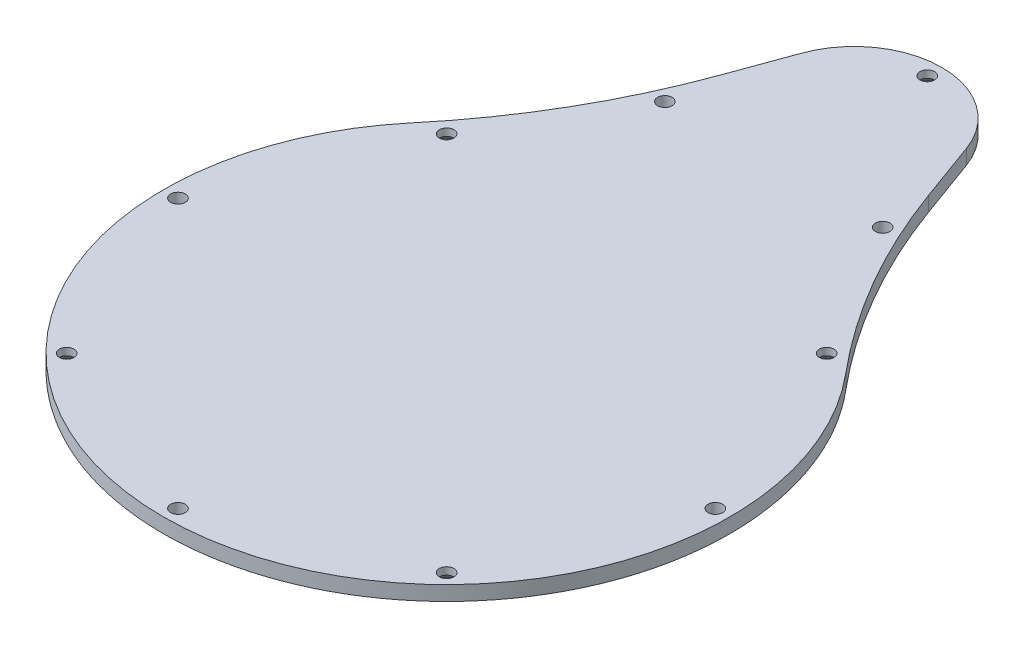
ISO-10303-21;
HEADER;
FILE_DESCRIPTION(('STEP AP214'),'2;1');
FILE_NAME('part.step','',(''),(''),'','','');
FILE_SCHEMA(('AUTOMOTIVE_DESIGN { 1 0 10303 214 1 1 1 1 }'));
ENDSEC;
DATA;
#1=APPLICATION_CONTEXT('core data for automotive mechanical design processes');
#2=APPLICATION_PROTOCOL_DEFINITION('international standard','automotive_design',2000,#1);
#3=PRODUCT_CONTEXT('',#1,'mechanical');
#4=PRODUCT('Part','Part','',(#3));
#5=PRODUCT_RELATED_PRODUCT_CATEGORY('part','',(#4));
#6=PRODUCT_DEFINITION_FORMATION('','',#4);
#7=PRODUCT_DEFINITION_CONTEXT('part definition',#1,'design');
#8=PRODUCT_DEFINITION('design','',#6,#7);
#9=PRODUCT_DEFINITION_SHAPE('','',#8);
#10=(LENGTH_UNIT() NAMED_UNIT(*) SI_UNIT(.MILLI.,.METRE.));
#11=(NAMED_UNIT(*) PLANE_ANGLE_UNIT() SI_UNIT($,.RADIAN.));
#12=(NAMED_UNIT(*) SI_UNIT($,.STERADIAN.) SOLID_ANGLE_UNIT());
#13=UNCERTAINTY_MEASURE_WITH_UNIT(LENGTH_MEASURE(1.E-05),#10,'distance_accuracy_value','');
#14=(GEOMETRIC_REPRESENTATION_CONTEXT(3) GLOBAL_UNCERTAINTY_ASSIGNED_CONTEXT((#13)) GLOBAL_UNIT_ASSIGNED_CONTEXT((#10,
#11,#12)) REPRESENTATION_CONTEXT('',''));
#15=CARTESIAN_POINT('',(0.,0.,0.));
#16=DIRECTION('',(0.,0.,1.));
#17=DIRECTION('',(1.,0.,0.));
#18=AXIS2_PLACEMENT_3D('',#15,#16,#17);
#19=CARTESIAN_POINT('',(47.3293309242248,-115.6,-142.15));
#20=DIRECTION('',(0.,1.,0.));
#21=DIRECTION('',(0.,0.,1.));
#22=AXIS2_PLACEMENT_3D('',#19,#20,#21);
#23=CYLINDRICAL_SURFACE('',#22,3.17499999999998);
#24=CARTESIAN_POINT('',(47.3293309242248,-115.6,-142.15));
#25=DIRECTION('',(0.,-1.,0.));
#26=DIRECTION('',(0.,0.,-1.));
#27=AXIS2_PLACEMENT_3D('',#24,#25,#26);
#28=CIRCLE('',#27,3.17499999999998);
#29=CARTESIAN_POINT('',(47.3293309242248,-115.6,-145.325));
#30=VERTEX_POINT('',#29);
#31=EDGE_CURVE('E228',#30,#30,#28,.F.);
#32=ORIENTED_EDGE('',*,*,#31,.F.);
#33=EDGE_LOOP('',(#32));
#34=FACE_BOUND('',#33,.T.);
#35=CARTESIAN_POINT('',(47.3293309242248,-109.25,-142.15));
#36=DIRECTION('',(0.,-1.,0.));
#37=DIRECTION('',(0.,0.,-1.));
#38=AXIS2_PLACEMENT_3D('',#35,#36,#37);
#39=CIRCLE('',#38,3.17499999999998);
#40=CARTESIAN_POINT('',(47.3293309242248,-109.25,-145.325));
#41=VERTEX_POINT('',#40);
#42=EDGE_CURVE('E211',#41,#41,#39,.F.);
#43=ORIENTED_EDGE('',*,*,#42,.T.);
#44=EDGE_LOOP('',(#43));
#45=FACE_BOUND('',#44,.T.);
#46=ADVANCED_FACE('F71',(#34,#45),#23,.F.);
#47=CARTESIAN_POINT('',(0.,-115.6,116.75));
#48=DIRECTION('',(0.,1.,0.));
#49=DIRECTION('',(0.,0.,1.));
#50=AXIS2_PLACEMENT_3D('',#47,#48,#49);
#51=CYLINDRICAL_SURFACE('',#50,3.175);
#52=CARTESIAN_POINT('',(0.,-115.6,116.75));
#53=DIRECTION('',(0.,-1.,0.));
#54=DIRECTION('',(0.,0.,-1.));
#55=AXIS2_PLACEMENT_3D('',#52,#53,#54);
#56=CIRCLE('',#55,3.175);
#57=CARTESIAN_POINT('',(0.,-115.6,113.575));
#58=VERTEX_POINT('',#57);
#59=EDGE_CURVE('E225',#58,#58,#56,.F.);
#60=ORIENTED_EDGE('',*,*,#59,.F.);
#61=EDGE_LOOP('',(#60));
#62=FACE_BOUND('',#61,.T.);
#63=CARTESIAN_POINT('',(0.,-109.25,116.75));
#64=DIRECTION('',(0.,-1.,0.));
#65=DIRECTION('',(0.,0.,-1.));
#66=AXIS2_PLACEMENT_3D('',#63,#64,#65);
#67=CIRCLE('',#66,3.175);
#68=CARTESIAN_POINT('',(0.,-109.25,113.575));
#69=VERTEX_POINT('',#68);
#70=EDGE_CURVE('E267',#69,#69,#67,.F.);
#71=ORIENTED_EDGE('',*,*,#70,.T.);
#72=EDGE_LOOP('',(#71));
#73=FACE_BOUND('',#72,.T.);
#74=ADVANCED_FACE('F316',(#62,#73),#51,.F.);
#75=CARTESIAN_POINT('',(-47.3293309242248,-115.6,-142.15));
#76=DIRECTION('',(0.,1.,0.));
#77=DIRECTION('',(0.,0.,1.));
#78=AXIS2_PLACEMENT_3D('',#75,#76,#77);
#79=CYLINDRICAL_SURFACE('',#78,3.17499999999998);
#80=CARTESIAN_POINT('',(-47.3293309242248,-115.6,-142.15));
#81=DIRECTION('',(0.,-1.,0.));
#82=DIRECTION('',(0.,0.,-1.));
#83=AXIS2_PLACEMENT_3D('',#80,#81,#82);
#84=CIRCLE('',#83,3.17499999999998);
#85=CARTESIAN_POINT('',(-47.3293309242248,-115.6,-145.325));
#86=VERTEX_POINT('',#85);
#87=EDGE_CURVE('E222',#86,#86,#84,.F.);
#88=ORIENTED_EDGE('',*,*,#87,.F.);
#89=EDGE_LOOP('',(#88));
#90=FACE_BOUND('',#89,.T.);
#91=CARTESIAN_POINT('',(-47.3293309242248,-109.25,-142.15));
#92=DIRECTION('',(0.,-1.,0.));
#93=DIRECTION('',(0.,0.,-1.));
#94=AXIS2_PLACEMENT_3D('',#91,#92,#93);
#95=CIRCLE('',#94,3.17499999999998);
#96=CARTESIAN_POINT('',(-47.3293309242248,-109.25,-145.325));
#97=VERTEX_POINT('',#96);
#98=EDGE_CURVE('E264',#97,#97,#95,.F.);
#99=ORIENTED_EDGE('',*,*,#98,.T.);
#100=EDGE_LOOP('',(#99));
#101=FACE_BOUND('',#100,.T.);
#102=ADVANCED_FACE('F322',(#90,#101),#79,.F.);
#103=CARTESIAN_POINT('',(-82.5547167035294,-115.6,-82.5547167035295));
#104=DIRECTION('',(0.,1.,0.));
#105=DIRECTION('',(0.,0.,1.));
#106=AXIS2_PLACEMENT_3D('',#103,#104,#105);
#107=CYLINDRICAL_SURFACE('',#106,3.17500000000001);
#108=CARTESIAN_POINT('',(-82.5547167035294,-112.425,-82.5547167035295));
#109=DIRECTION('',(0.,-1.,0.));
#110=DIRECTION('',(0.,0.,-1.));
#111=AXIS2_PLACEMENT_3D('',#108,#109,#110);
#112=CIRCLE('',#111,3.17500000000001);
#113=CARTESIAN_POINT('',(-82.5547167035294,-112.425,-85.7297167035294));
#114=VERTEX_POINT('',#113);
#115=EDGE_CURVE('E79',#114,#114,#112,.T.);
#116=ORIENTED_EDGE('',*,*,#115,.T.);
#117=EDGE_LOOP('',(#116));
#118=FACE_BOUND('',#117,.T.);
#119=CARTESIAN_POINT('',(-82.5547167035294,-109.25,-82.5547167035295));
#120=DIRECTION('',(0.,-1.,0.));
#121=DIRECTION('',(0.,0.,-1.));
#122=AXIS2_PLACEMENT_3D('',#119,#120,#121);
#123=CIRCLE('',#122,3.17500000000001);
#124=CARTESIAN_POINT('',(-82.5547167035294,-109.25,-85.7297167035295));
#125=VERTEX_POINT('',#124);
#126=EDGE_CURVE('E261',#125,#125,#123,.F.);
#127=ORIENTED_EDGE('',*,*,#126,.T.);
#128=EDGE_LOOP('',(#127));
#129=FACE_BOUND('',#128,.T.);
#130=ADVANCED_FACE('F188',(#118,#129),#107,.F.);
#131=CARTESIAN_POINT('',(82.5547167035294,-115.6,82.5547167035294));
#132=DIRECTION('',(0.,1.,0.));
#133=DIRECTION('',(0.,0.,1.));
#134=AXIS2_PLACEMENT_3D('',#131,#132,#133);
#135=CYLINDRICAL_SURFACE('',#134,3.17500000000001);
#136=CARTESIAN_POINT('',(82.5547167035294,-112.425,82.5547167035294));
#137=DIRECTION('',(0.,-1.,0.));
#138=DIRECTION('',(0.,0.,-1.));
#139=AXIS2_PLACEMENT_3D('',#136,#137,#138);
#140=CIRCLE('',#139,3.17500000000001);
#141=CARTESIAN_POINT('',(82.5547167035294,-112.425,79.3797167035294));
#142=VERTEX_POINT('',#141);
#143=EDGE_CURVE('E180',#142,#142,#140,.T.);
#144=ORIENTED_EDGE('',*,*,#143,.T.);
#145=EDGE_LOOP('',(#144));
#146=FACE_BOUND('',#145,.T.);
#147=CARTESIAN_POINT('',(82.5547167035294,-109.25,82.5547167035294));
#148=DIRECTION('',(0.,-1.,0.));
#149=DIRECTION('',(0.,0.,-1.));
#150=AXIS2_PLACEMENT_3D('',#147,#148,#149);
#151=CIRCLE('',#150,3.17500000000001);
#152=CARTESIAN_POINT('',(82.5547167035294,-109.25,79.3797167035294));
#153=VERTEX_POINT('',#152);
#154=EDGE_CURVE('E258',#153,#153,#151,.F.);
#155=ORIENTED_EDGE('',*,*,#154,.T.);
#156=EDGE_LOOP('',(#155));
#157=FACE_BOUND('',#156,.T.);
#158=ADVANCED_FACE('F334',(#146,#157),#135,.F.);
#159=CARTESIAN_POINT('',(0.,-115.6,-208.825));
#160=DIRECTION('',(0.,1.,0.));
#161=DIRECTION('',(0.,0.,1.));
#162=AXIS2_PLACEMENT_3D('',#159,#160,#161);
#163=CYLINDRICAL_SURFACE('',#162,3.17500000000001);
#164=CARTESIAN_POINT('',(0.,-112.425,-208.825));
#165=DIRECTION('',(0.,-1.,0.));
#166=DIRECTION('',(0.,0.,-1.));
#167=AXIS2_PLACEMENT_3D('',#164,#165,#166);
#168=CIRCLE('',#167,3.17500000000001);
#169=CARTESIAN_POINT('',(0.,-112.425,-212.));
#170=VERTEX_POINT('',#169);
#171=EDGE_CURVE('E12',#170,#170,#168,.T.);
#172=ORIENTED_EDGE('',*,*,#171,.T.);
#173=EDGE_LOOP('',(#172));
#174=FACE_BOUND('',#173,.T.);
#175=CARTESIAN_POINT('',(0.,-109.25,-208.825));
#176=DIRECTION('',(0.,-1.,0.));
#177=DIRECTION('',(0.,0.,-1.));
#178=AXIS2_PLACEMENT_3D('',#175,#176,#177);
#179=CIRCLE('',#178,3.17500000000001);
#180=CARTESIAN_POINT('',(0.,-109.25,-212.));
#181=VERTEX_POINT('',#180);
#182=EDGE_CURVE('E255',#181,#181,#179,.F.);
#183=ORIENTED_EDGE('',*,*,#182,.T.);
#184=EDGE_LOOP('',(#183));
#185=FACE_BOUND('',#184,.T.);
#186=ADVANCED_FACE('F337',(#174,#185),#163,.F.);
#187=CARTESIAN_POINT('',(82.5547167035294,-115.6,-82.5547167035294));
#188=DIRECTION('',(0.,1.,0.));
#189=DIRECTION('',(0.,0.,1.));
#190=AXIS2_PLACEMENT_3D('',#187,#188,#189);
#191=CYLINDRICAL_SURFACE('',#190,3.175);
#192=CARTESIAN_POINT('',(82.5547167035294,-112.425,-82.5547167035294));
#193=DIRECTION('',(0.,-1.,0.));
#194=DIRECTION('',(0.,0.,-1.));
#195=AXIS2_PLACEMENT_3D('',#192,#193,#194);
#196=CIRCLE('',#195,3.175);
#197=CARTESIAN_POINT('',(82.5547167035294,-112.425,-85.7297167035294));
#198=VERTEX_POINT('',#197);
#199=EDGE_CURVE('E177',#198,#198,#196,.T.);
#200=ORIENTED_EDGE('',*,*,#199,.T.);
#201=EDGE_LOOP('',(#200));
#202=FACE_BOUND('',#201,.T.);
#203=CARTESIAN_POINT('',(82.5547167035294,-109.25,-82.5547167035294));
#204=DIRECTION('',(0.,-1.,0.));
#205=DIRECTION('',(0.,0.,-1.));
#206=AXIS2_PLACEMENT_3D('',#203,#204,#205);
#207=CIRCLE('',#206,3.175);
#208=CARTESIAN_POINT('',(82.5547167035294,-109.25,-85.7297167035294));
#209=VERTEX_POINT('',#208);
#210=EDGE_CURVE('E252',#209,#209,#207,.F.);
#211=ORIENTED_EDGE('',*,*,#210,.T.);
#212=EDGE_LOOP('',(#211));
#213=FACE_BOUND('',#212,.T.);
#214=ADVANCED_FACE('F341',(#202,#213),#191,.F.);
#215=CARTESIAN_POINT('',(-82.5547167035295,-115.6,82.5547167035294));
#216=DIRECTION('',(0.,1.,0.));
#217=DIRECTION('',(0.,0.,1.));
#218=AXIS2_PLACEMENT_3D('',#215,#216,#217);
#219=CYLINDRICAL_SURFACE('',#218,3.175);
#220=CARTESIAN_POINT('',(-82.5547167035295,-112.425,82.5547167035294));
#221=DIRECTION('',(0.,-1.,0.));
#222=DIRECTION('',(0.,0.,-1.));
#223=AXIS2_PLACEMENT_3D('',#220,#221,#222);
#224=CIRCLE('',#223,3.175);
#225=CARTESIAN_POINT('',(-82.5547167035295,-112.425,79.3797167035294));
#226=VERTEX_POINT('',#225);
#227=EDGE_CURVE('E183',#226,#226,#224,.T.);
#228=ORIENTED_EDGE('',*,*,#227,.T.);
#229=EDGE_LOOP('',(#228));
#230=FACE_BOUND('',#229,.T.);
#231=CARTESIAN_POINT('',(-82.5547167035295,-109.25,82.5547167035294));
#232=DIRECTION('',(0.,-1.,0.));
#233=DIRECTION('',(0.,0.,-1.));
#234=AXIS2_PLACEMENT_3D('',#231,#232,#233);
#235=CIRCLE('',#234,3.175);
#236=CARTESIAN_POINT('',(-82.5547167035295,-109.25,79.3797167035294));
#237=VERTEX_POINT('',#236);
#238=EDGE_CURVE('E249',#237,#237,#235,.F.);
#239=ORIENTED_EDGE('',*,*,#238,.T.);
#240=EDGE_LOOP('',(#239));
#241=FACE_BOUND('',#240,.T.);
#242=ADVANCED_FACE('F345',(#230,#241),#219,.F.);
#243=CARTESIAN_POINT('',(0.,-115.6,0.));
#244=DIRECTION('',(0.,1.,0.));
#245=DIRECTION('',(0.,0.,1.));
#246=AXIS2_PLACEMENT_3D('',#243,#244,#245);
#247=CYLINDRICAL_SURFACE('',#246,123.1);
#248=CARTESIAN_POINT('',(0.,-109.25,0.));
#249=DIRECTION('',(0.,-1.,0.));
#250=DIRECTION('',(0.,0.,-1.));
#251=AXIS2_PLACEMENT_3D('',#248,#249,#250);
#252=CIRCLE('',#251,123.1);
#253=CARTESIAN_POINT('',(94.3000709479462,-109.25,-79.1271547524129));
#254=VERTEX_POINT('',#253);
#255=CARTESIAN_POINT('',(-94.3000709479463,-109.25,-79.1271547524127));
#256=VERTEX_POINT('',#255);
#257=EDGE_CURVE('E239',#254,#256,#252,.T.);
#258=ORIENTED_EDGE('',*,*,#257,.T.);
#259=DIRECTION('',(0.,1.,0.));
#260=VECTOR('',#259,1.);
#261=CARTESIAN_POINT('',(-94.3000709479463,-115.6,-79.1271547524127));
#262=LINE('',#261,#260);
#263=CARTESIAN_POINT('',(-94.3000709479463,-115.6,-79.1271547524127));
#264=VERTEX_POINT('',#263);
#265=EDGE_CURVE('E160',#264,#256,#262,.T.);
#266=ORIENTED_EDGE('',*,*,#265,.F.);
#267=CARTESIAN_POINT('',(0.,-115.6,0.));
#268=DIRECTION('',(0.,-1.,0.));
#269=DIRECTION('',(0.,0.,-1.));
#270=AXIS2_PLACEMENT_3D('',#267,#268,#269);
#271=CIRCLE('',#270,123.1);
#272=CARTESIAN_POINT('',(-87.044844764064,-115.6,87.0448447640639));
#273=VERTEX_POINT('',#272);
#274=EDGE_CURVE('E145',#273,#264,#271,.T.);
#275=ORIENTED_EDGE('',*,*,#274,.F.);
#276=CARTESIAN_POINT('',(87.0448447640639,-115.6,87.044844764064));
#277=VERTEX_POINT('',#276);
#278=EDGE_CURVE('E140',#277,#273,#271,.T.);
#279=ORIENTED_EDGE('',*,*,#278,.F.);
#280=CARTESIAN_POINT('',(94.3000709479462,-115.6,-79.1271547524129));
#281=VERTEX_POINT('',#280);
#282=EDGE_CURVE('E132',#281,#277,#271,.T.);
#283=ORIENTED_EDGE('',*,*,#282,.F.);
#284=DIRECTION('',(0.,1.,0.));
#285=VECTOR('',#284,1.);
#286=CARTESIAN_POINT('',(94.3000709479462,-115.6,-79.1271547524129));
#287=LINE('',#286,#285);
#288=EDGE_CURVE('E136',#281,#254,#287,.T.);
#289=ORIENTED_EDGE('',*,*,#288,.T.);
#290=EDGE_LOOP('',(#258,#266,#275,#279,#283,#289));
#291=FACE_BOUND('',#290,.T.);
#292=ADVANCED_FACE('F134',(#291),#247,.T.);
#293=CARTESIAN_POINT('',(-310.404168796494,-115.6,-260.460023553028));
#294=DIRECTION('',(0.,1.,0.));
#295=DIRECTION('',(0.,0.,1.));
#296=AXIS2_PLACEMENT_3D('',#293,#294,#295);
#297=CYLINDRICAL_SURFACE('',#296,282.10386458607);
#298=CARTESIAN_POINT('',(-310.404168796494,-109.25,-260.460023553028));
#299=DIRECTION('',(0.,-1.,0.));
#300=DIRECTION('',(0.,0.,-1.));
#301=AXIS2_PLACEMENT_3D('',#298,#299,#300);
#302=CIRCLE('',#301,282.10386458607);
#303=CARTESIAN_POINT('',(-45.3132489497764,-109.25,-163.974819354577));
#304=VERTEX_POINT('',#303);
#305=EDGE_CURVE('E241',#256,#304,#302,.F.);
#306=ORIENTED_EDGE('',*,*,#305,.T.);
#307=DIRECTION('',(0.,1.,0.));
#308=VECTOR('',#307,1.);
#309=CARTESIAN_POINT('',(-45.3132489497764,-115.6,-163.974819354577));
#310=LINE('',#309,#308);
#311=CARTESIAN_POINT('',(-45.3132489497764,-115.6,-163.974819354577));
#312=VERTEX_POINT('',#311);
#313=EDGE_CURVE('E165',#312,#304,#310,.T.);
#314=ORIENTED_EDGE('',*,*,#313,.F.);
#315=CARTESIAN_POINT('',(-310.404168796494,-115.6,-260.460023553028));
#316=DIRECTION('',(0.,-1.,0.));
#317=DIRECTION('',(0.,0.,-1.));
#318=AXIS2_PLACEMENT_3D('',#315,#316,#317);
#319=CIRCLE('',#318,282.10386458607);
#320=EDGE_CURVE('E143',#264,#312,#319,.F.);
#321=ORIENTED_EDGE('',*,*,#320,.F.);
#322=ORIENTED_EDGE('',*,*,#265,.T.);
#323=EDGE_LOOP('',(#306,#314,#321,#322));
#324=FACE_BOUND('',#323,.T.);
#325=ADVANCED_FACE('F300',(#324),#297,.F.);
#326=CARTESIAN_POINT('',(-92.713096844564,-115.6,-33.7448075780601));
#327=DIRECTION('',(0.939692620785911,0.,0.34202014332566));
#328=DIRECTION('',(0.34202014332566,0.,-0.939692620785912));
#329=AXIS2_PLACEMENT_3D('',#326,#327,#328);
#330=PLANE('',#329);
#331=DIRECTION('',(0.34202014332566,0.,-0.939692620785912));
#332=VECTOR('',#331,1.);
#333=CARTESIAN_POINT('',(-92.713096844564,-109.25,-33.7448075780601));
#334=LINE('',#333,#332);
#335=CARTESIAN_POINT('',(-35.8022888519432,-109.25,-190.105967460708));
#336=VERTEX_POINT('',#335);
#337=EDGE_CURVE('E243',#304,#336,#334,.T.);
#338=ORIENTED_EDGE('',*,*,#337,.T.);
#339=DIRECTION('',(0.,1.,0.));
#340=VECTOR('',#339,1.);
#341=CARTESIAN_POINT('',(-35.8022888519432,-115.6,-190.105967460708));
#342=LINE('',#341,#340);
#343=CARTESIAN_POINT('',(-35.8022888519432,-115.6,-190.105967460708));
#344=VERTEX_POINT('',#343);
#345=EDGE_CURVE('E276',#344,#336,#342,.T.);
#346=ORIENTED_EDGE('',*,*,#345,.F.);
#347=DIRECTION('',(0.34202014332566,0.,-0.939692620785912));
#348=VECTOR('',#347,1.);
#349=CARTESIAN_POINT('',(-92.713096844564,-115.6,-33.7448075780601));
#350=LINE('',#349,#348);
#351=EDGE_CURVE('E215',#312,#344,#350,.T.);
#352=ORIENTED_EDGE('',*,*,#351,.F.);
#353=ORIENTED_EDGE('',*,*,#313,.T.);
#354=EDGE_LOOP('',(#338,#346,#352,#353));
#355=FACE_BOUND('',#354,.T.);
#356=ADVANCED_FACE('F283',(#355),#330,.F.);
#357=CARTESIAN_POINT('',(0.,-115.6,-177.075));
#358=DIRECTION('',(0.,1.,0.));
#359=DIRECTION('',(0.,0.,1.));
#360=AXIS2_PLACEMENT_3D('',#357,#358,#359);
#361=CYLINDRICAL_SURFACE('',#360,38.1);
#362=CARTESIAN_POINT('',(0.,-109.25,-177.075));
#363=DIRECTION('',(0.,-1.,0.));
#364=DIRECTION('',(0.,0.,-1.));
#365=AXIS2_PLACEMENT_3D('',#362,#363,#364);
#366=CIRCLE('',#365,38.1);
#367=CARTESIAN_POINT('',(35.8022888519432,-109.25,-190.105967460708));
#368=VERTEX_POINT('',#367);
#369=EDGE_CURVE('E245',#336,#368,#366,.T.);
#370=ORIENTED_EDGE('',*,*,#369,.T.);
#371=DIRECTION('',(0.,1.,0.));
#372=VECTOR('',#371,1.);
#373=CARTESIAN_POINT('',(35.8022888519432,-115.6,-190.105967460708));
#374=LINE('',#373,#372);
#375=CARTESIAN_POINT('',(35.8022888519432,-115.6,-190.105967460708));
#376=VERTEX_POINT('',#375);
#377=EDGE_CURVE('E273',#376,#368,#374,.T.);
#378=ORIENTED_EDGE('',*,*,#377,.F.);
#379=CARTESIAN_POINT('',(0.,-115.6,-177.075));
#380=DIRECTION('',(0.,-1.,0.));
#381=DIRECTION('',(0.,0.,-1.));
#382=AXIS2_PLACEMENT_3D('',#379,#380,#381);
#383=CIRCLE('',#382,38.1);
#384=CARTESIAN_POINT('',(0.,-115.6,-215.175));
#385=VERTEX_POINT('',#384);
#386=EDGE_CURVE('E217',#385,#376,#383,.T.);
#387=ORIENTED_EDGE('',*,*,#386,.F.);
#388=EDGE_CURVE('E218',#344,#385,#383,.T.);
#389=ORIENTED_EDGE('',*,*,#388,.F.);
#390=ORIENTED_EDGE('',*,*,#345,.T.);
#391=EDGE_LOOP('',(#370,#378,#387,#389,#390));
#392=FACE_BOUND('',#391,.T.);
#393=ADVANCED_FACE('F294',(#392),#361,.T.);
#394=CARTESIAN_POINT('',(92.7130968445642,-115.6,-33.7448075780604));
#395=DIRECTION('',(-0.939692620785911,0.,0.342020143325662));
#396=DIRECTION('',(0.342020143325662,0.,0.939692620785911));
#397=AXIS2_PLACEMENT_3D('',#394,#395,#396);
#398=PLANE('',#397);
#399=DIRECTION('',(0.342020143325662,0.,0.939692620785911));
#400=VECTOR('',#399,1.);
#401=CARTESIAN_POINT('',(92.7130968445642,-109.25,-33.7448075780604));
#402=LINE('',#401,#400);
#403=CARTESIAN_POINT('',(45.3132489497764,-109.25,-163.974819354577));
#404=VERTEX_POINT('',#403);
#405=EDGE_CURVE('E247',#368,#404,#402,.T.);
#406=ORIENTED_EDGE('',*,*,#405,.T.);
#407=DIRECTION('',(0.,1.,0.));
#408=VECTOR('',#407,1.);
#409=CARTESIAN_POINT('',(45.3132489497764,-115.6,-163.974819354577));
#410=LINE('',#409,#408);
#411=CARTESIAN_POINT('',(45.3132489497764,-115.6,-163.974819354577));
#412=VERTEX_POINT('',#411);
#413=EDGE_CURVE('E231',#412,#404,#410,.T.);
#414=ORIENTED_EDGE('',*,*,#413,.F.);
#415=DIRECTION('',(0.342020143325662,0.,0.939692620785911));
#416=VECTOR('',#415,1.);
#417=CARTESIAN_POINT('',(92.7130968445642,-115.6,-33.7448075780604));
#418=LINE('',#417,#416);
#419=EDGE_CURVE('E151',#376,#412,#418,.T.);
#420=ORIENTED_EDGE('',*,*,#419,.F.);
#421=ORIENTED_EDGE('',*,*,#377,.T.);
#422=EDGE_LOOP('',(#406,#414,#420,#421));
#423=FACE_BOUND('',#422,.T.);
#424=ADVANCED_FACE('F298',(#423),#398,.F.);
#425=CARTESIAN_POINT('',(310.404168796494,-115.6,-260.460023553028));
#426=DIRECTION('',(0.,1.,0.));
#427=DIRECTION('',(0.,0.,1.));
#428=AXIS2_PLACEMENT_3D('',#425,#426,#427);
#429=CYLINDRICAL_SURFACE('',#428,282.10386458607);
#430=CARTESIAN_POINT('',(310.404168796494,-109.25,-260.460023553028));
#431=DIRECTION('',(0.,-1.,0.));
#432=DIRECTION('',(0.,0.,-1.));
#433=AXIS2_PLACEMENT_3D('',#430,#431,#432);
#434=CIRCLE('',#433,282.10386458607);
#435=EDGE_CURVE('E159',#404,#254,#434,.F.);
#436=ORIENTED_EDGE('',*,*,#435,.T.);
#437=ORIENTED_EDGE('',*,*,#288,.F.);
#438=CARTESIAN_POINT('',(310.404168796494,-115.6,-260.460023553028));
#439=DIRECTION('',(0.,-1.,0.));
#440=DIRECTION('',(0.,0.,-1.));
#441=AXIS2_PLACEMENT_3D('',#438,#439,#440);
#442=CIRCLE('',#441,282.10386458607);
#443=EDGE_CURVE('E147',#412,#281,#442,.F.);
#444=ORIENTED_EDGE('',*,*,#443,.F.);
#445=ORIENTED_EDGE('',*,*,#413,.T.);
#446=EDGE_LOOP('',(#436,#437,#444,#445));
#447=FACE_BOUND('',#446,.T.);
#448=ADVANCED_FACE('F157',(#447),#429,.F.);
#449=CARTESIAN_POINT('',(-116.75,-115.6,0.));
#450=DIRECTION('',(0.,1.,0.));
#451=DIRECTION('',(0.,0.,1.));
#452=AXIS2_PLACEMENT_3D('',#449,#450,#451);
#453=CYLINDRICAL_SURFACE('',#452,3.175);
#454=CARTESIAN_POINT('',(-116.75,-115.6,0.));
#455=DIRECTION('',(0.,-1.,0.));
#456=DIRECTION('',(0.,0.,-1.));
#457=AXIS2_PLACEMENT_3D('',#454,#455,#456);
#458=CIRCLE('',#457,3.175);
#459=CARTESIAN_POINT('',(-116.75,-115.6,-3.17500000000003));
#460=VERTEX_POINT('',#459);
#461=EDGE_CURVE('E155',#460,#460,#458,.F.);
#462=ORIENTED_EDGE('',*,*,#461,.F.);
#463=EDGE_LOOP('',(#462));
#464=FACE_BOUND('',#463,.T.);
#465=CARTESIAN_POINT('',(-116.75,-109.25,0.));
#466=DIRECTION('',(0.,-1.,0.));
#467=DIRECTION('',(0.,0.,-1.));
#468=AXIS2_PLACEMENT_3D('',#465,#466,#467);
#469=CIRCLE('',#468,3.175);
#470=CARTESIAN_POINT('',(-116.75,-109.25,-3.17500000000003));
#471=VERTEX_POINT('',#470);
#472=EDGE_CURVE('E235',#471,#471,#469,.F.);
#473=ORIENTED_EDGE('',*,*,#472,.T.);
#474=EDGE_LOOP('',(#473));
#475=FACE_BOUND('',#474,.T.);
#476=ADVANCED_FACE('F362',(#464,#475),#453,.F.);
#477=CARTESIAN_POINT('',(116.75,-115.6,0.));
#478=DIRECTION('',(0.,1.,0.));
#479=DIRECTION('',(0.,0.,1.));
#480=AXIS2_PLACEMENT_3D('',#477,#478,#479);
#481=CYLINDRICAL_SURFACE('',#480,3.175);
#482=CARTESIAN_POINT('',(116.75,-115.6,0.));
#483=DIRECTION('',(0.,-1.,0.));
#484=DIRECTION('',(0.,0.,-1.));
#485=AXIS2_PLACEMENT_3D('',#482,#483,#484);
#486=CIRCLE('',#485,3.175);
#487=CARTESIAN_POINT('',(116.75,-115.6,-3.17499999999998));
#488=VERTEX_POINT('',#487);
#489=EDGE_CURVE('E206',#488,#488,#486,.F.);
#490=ORIENTED_EDGE('',*,*,#489,.F.);
#491=EDGE_LOOP('',(#490));
#492=FACE_BOUND('',#491,.T.);
#493=CARTESIAN_POINT('',(116.75,-109.25,0.));
#494=DIRECTION('',(0.,-1.,0.));
#495=DIRECTION('',(0.,0.,-1.));
#496=AXIS2_PLACEMENT_3D('',#493,#494,#495);
#497=CIRCLE('',#496,3.175);
#498=CARTESIAN_POINT('',(116.75,-109.25,-3.17499999999998));
#499=VERTEX_POINT('',#498);
#500=EDGE_CURVE('E232',#499,#499,#497,.F.);
#501=ORIENTED_EDGE('',*,*,#500,.T.);
#502=EDGE_LOOP('',(#501));
#503=FACE_BOUND('',#502,.T.);
#504=ADVANCED_FACE('F365',(#492,#503),#481,.F.);
#505=CARTESIAN_POINT('',(0.,-109.25,0.));
#506=DIRECTION('',(0.,-1.,0.));
#507=DIRECTION('',(0.,0.,-1.));
#508=AXIS2_PLACEMENT_3D('',#505,#506,#507);
#509=PLANE('',#508);
#510=ORIENTED_EDGE('',*,*,#500,.F.);
#511=EDGE_LOOP('',(#510));
#512=FACE_BOUND('',#511,.T.);
#513=ORIENTED_EDGE('',*,*,#472,.F.);
#514=EDGE_LOOP('',(#513));
#515=FACE_BOUND('',#514,.T.);
#516=ORIENTED_EDGE('',*,*,#435,.F.);
#517=ORIENTED_EDGE('',*,*,#405,.F.);
#518=ORIENTED_EDGE('',*,*,#369,.F.);
#519=ORIENTED_EDGE('',*,*,#337,.F.);
#520=ORIENTED_EDGE('',*,*,#305,.F.);
#521=ORIENTED_EDGE('',*,*,#257,.F.);
#522=EDGE_LOOP('',(#516,#517,#518,#519,#520,#521));
#523=FACE_BOUND('',#522,.T.);
#524=ORIENTED_EDGE('',*,*,#238,.F.);
#525=EDGE_LOOP('',(#524));
#526=FACE_BOUND('',#525,.T.);
#527=ORIENTED_EDGE('',*,*,#210,.F.);
#528=EDGE_LOOP('',(#527));
#529=FACE_BOUND('',#528,.T.);
#530=ORIENTED_EDGE('',*,*,#182,.F.);
#531=EDGE_LOOP('',(#530));
#532=FACE_BOUND('',#531,.T.);
#533=ORIENTED_EDGE('',*,*,#154,.F.);
#534=EDGE_LOOP('',(#533));
#535=FACE_BOUND('',#534,.T.);
#536=ORIENTED_EDGE('',*,*,#126,.F.);
#537=EDGE_LOOP('',(#536));
#538=FACE_BOUND('',#537,.T.);
#539=ORIENTED_EDGE('',*,*,#98,.F.);
#540=EDGE_LOOP('',(#539));
#541=FACE_BOUND('',#540,.T.);
#542=ORIENTED_EDGE('',*,*,#70,.F.);
#543=EDGE_LOOP('',(#542));
#544=FACE_BOUND('',#543,.T.);
#545=ORIENTED_EDGE('',*,*,#42,.F.);
#546=EDGE_LOOP('',(#545));
#547=FACE_BOUND('',#546,.T.);
#548=ADVANCED_FACE('F200',(#512,#515,#523,#526,#529,#532,#535,#538,#541,#544,#547),#509,.F.);
#549=CARTESIAN_POINT('',(0.,-115.6,0.));
#550=DIRECTION('',(0.,-1.,0.));
#551=DIRECTION('',(0.,0.,-1.));
#552=AXIS2_PLACEMENT_3D('',#549,#550,#551);
#553=PLANE('',#552);
#554=CARTESIAN_POINT('',(82.5547167035294,-115.6,-82.5547167035294));
#555=DIRECTION('',(0.,-1.,0.));
#556=DIRECTION('',(0.,0.,-1.));
#557=AXIS2_PLACEMENT_3D('',#554,#555,#556);
#558=CIRCLE('',#557,6.35000000000002);
#559=CARTESIAN_POINT('',(82.5547167035294,-115.6,-88.9047167035294));
#560=VERTEX_POINT('',#559);
#561=EDGE_CURVE('E174',#560,#560,#558,.F.);
#562=ORIENTED_EDGE('',*,*,#561,.T.);
#563=EDGE_LOOP('',(#562));
#564=FACE_BOUND('',#563,.T.);
#565=CARTESIAN_POINT('',(-82.5547167035294,-115.6,-82.5547167035295));
#566=DIRECTION('',(0.,-1.,0.));
#567=DIRECTION('',(0.,0.,-1.));
#568=AXIS2_PLACEMENT_3D('',#565,#566,#567);
#569=CIRCLE('',#568,6.35000000000002);
#570=CARTESIAN_POINT('',(-82.5547167035294,-115.6,-88.9047167035295));
#571=VERTEX_POINT('',#570);
#572=EDGE_CURVE('E162',#571,#571,#569,.F.);
#573=ORIENTED_EDGE('',*,*,#572,.T.);
#574=EDGE_LOOP('',(#573));
#575=FACE_BOUND('',#574,.T.);
#576=ORIENTED_EDGE('',*,*,#489,.T.);
#577=EDGE_LOOP('',(#576));
#578=FACE_BOUND('',#577,.T.);
#579=ORIENTED_EDGE('',*,*,#461,.T.);
#580=EDGE_LOOP('',(#579));
#581=FACE_BOUND('',#580,.T.);
#582=ORIENTED_EDGE('',*,*,#282,.T.);
#583=CARTESIAN_POINT('',(82.5547167035294,-115.6,82.5547167035294));
#584=DIRECTION('',(0.,-1.,0.));
#585=DIRECTION('',(0.,0.,-1.));
#586=AXIS2_PLACEMENT_3D('',#583,#584,#585);
#587=CIRCLE('',#586,6.35000000000002);
#588=EDGE_CURVE('E172',#277,#277,#587,.F.);
#589=ORIENTED_EDGE('',*,*,#588,.T.);
#590=ORIENTED_EDGE('',*,*,#278,.T.);
#591=CARTESIAN_POINT('',(-82.5547167035295,-115.6,82.5547167035294));
#592=DIRECTION('',(0.,-1.,0.));
#593=DIRECTION('',(0.,0.,-1.));
#594=AXIS2_PLACEMENT_3D('',#591,#592,#593);
#595=CIRCLE('',#594,6.35000000000002);
#596=EDGE_CURVE('E89',#273,#273,#595,.F.);
#597=ORIENTED_EDGE('',*,*,#596,.T.);
#598=ORIENTED_EDGE('',*,*,#274,.T.);
#599=ORIENTED_EDGE('',*,*,#320,.T.);
#600=ORIENTED_EDGE('',*,*,#351,.T.);
#601=ORIENTED_EDGE('',*,*,#388,.T.);
#602=CARTESIAN_POINT('',(0.,-115.6,-208.825));
#603=DIRECTION('',(0.,-1.,0.));
#604=DIRECTION('',(0.,0.,-1.));
#605=AXIS2_PLACEMENT_3D('',#602,#603,#604);
#606=CIRCLE('',#605,6.34999999999997);
#607=EDGE_CURVE('E84',#385,#385,#606,.F.);
#608=ORIENTED_EDGE('',*,*,#607,.T.);
#609=ORIENTED_EDGE('',*,*,#386,.T.);
#610=ORIENTED_EDGE('',*,*,#419,.T.);
#611=ORIENTED_EDGE('',*,*,#443,.T.);
#612=EDGE_LOOP('',(#582,#589,#590,#597,#598,#599,#600,#601,#608,#609,#610,#611));
#613=FACE_BOUND('',#612,.T.);
#614=ORIENTED_EDGE('',*,*,#87,.T.);
#615=EDGE_LOOP('',(#614));
#616=FACE_BOUND('',#615,.T.);
#617=ORIENTED_EDGE('',*,*,#59,.T.);
#618=EDGE_LOOP('',(#617));
#619=FACE_BOUND('',#618,.T.);
#620=ORIENTED_EDGE('',*,*,#31,.T.);
#621=EDGE_LOOP('',(#620));
#622=FACE_BOUND('',#621,.T.);
#623=ADVANCED_FACE('F148',(#564,#575,#578,#581,#613,#616,#619,#622),#553,.T.);
#624=CARTESIAN_POINT('',(82.5547167035294,-115.6,-82.5547167035294));
#625=DIRECTION('',(0.,-1.,0.));
#626=DIRECTION('',(0.,0.,-1.));
#627=AXIS2_PLACEMENT_3D('',#624,#625,#626);
#628=CONICAL_SURFACE('',#627,6.35000000000002,0.785398163397448);
#629=ORIENTED_EDGE('',*,*,#199,.F.);
#630=EDGE_LOOP('',(#629));
#631=FACE_BOUND('',#630,.T.);
#632=ORIENTED_EDGE('',*,*,#561,.F.);
#633=EDGE_LOOP('',(#632));
#634=FACE_BOUND('',#633,.T.);
#635=ADVANCED_FACE('F199',(#631,#634),#628,.F.);
#636=CARTESIAN_POINT('',(82.5547167035294,-115.6,82.5547167035294));
#637=DIRECTION('',(0.,-1.,0.));
#638=DIRECTION('',(0.,0.,-1.));
#639=AXIS2_PLACEMENT_3D('',#636,#637,#638);
#640=CONICAL_SURFACE('',#639,6.35000000000002,0.785398163397449);
#641=ORIENTED_EDGE('',*,*,#143,.F.);
#642=EDGE_LOOP('',(#641));
#643=FACE_BOUND('',#642,.T.);
#644=ORIENTED_EDGE('',*,*,#588,.F.);
#645=EDGE_LOOP('',(#644));
#646=FACE_BOUND('',#645,.T.);
#647=ADVANCED_FACE('F302',(#643,#646),#640,.F.);
#648=CARTESIAN_POINT('',(-82.5547167035295,-115.6,82.5547167035294));
#649=DIRECTION('',(0.,-1.,0.));
#650=DIRECTION('',(0.,0.,-1.));
#651=AXIS2_PLACEMENT_3D('',#648,#649,#650);
#652=CONICAL_SURFACE('',#651,6.35000000000002,0.785398163397448);
#653=ORIENTED_EDGE('',*,*,#227,.F.);
#654=EDGE_LOOP('',(#653));
#655=FACE_BOUND('',#654,.T.);
#656=ORIENTED_EDGE('',*,*,#596,.F.);
#657=EDGE_LOOP('',(#656));
#658=FACE_BOUND('',#657,.T.);
#659=ADVANCED_FACE('F194',(#655,#658),#652,.F.);
#660=CARTESIAN_POINT('',(-82.5547167035294,-115.6,-82.5547167035295));
#661=DIRECTION('',(0.,-1.,0.));
#662=DIRECTION('',(0.,0.,-1.));
#663=AXIS2_PLACEMENT_3D('',#660,#661,#662);
#664=CONICAL_SURFACE('',#663,6.35000000000002,0.785398163397449);
#665=CARTESIAN_POINT('',(-82.5547167035294,-112.425,-85.7297167035294));
#666=CARTESIAN_POINT('',(-82.5547167035294,-112.458072916667,-85.7627896201961));
#667=CARTESIAN_POINT('',(-82.5547167035294,-112.491145833333,-85.7958625368628));
#668=CARTESIAN_POINT('',(-82.5547167035294,-112.557291666667,-85.8620083701961));
#669=CARTESIAN_POINT('',(-82.5547167035294,-112.590364583333,-85.8950812868628));
#670=CARTESIAN_POINT('',(-82.5547167035294,-112.656510416667,-85.9612271201961));
#671=CARTESIAN_POINT('',(-82.5547167035294,-112.689583333333,-85.9943000368628));
#672=CARTESIAN_POINT('',(-82.5547167035294,-112.755729166667,-86.0604458701961));
#673=CARTESIAN_POINT('',(-82.5547167035294,-112.788802083333,-86.0935187868628));
#674=CARTESIAN_POINT('',(-82.5547167035294,-112.854947916667,-86.1596646201961));
#675=CARTESIAN_POINT('',(-82.5547167035294,-112.888020833333,-86.1927375368628));
#676=CARTESIAN_POINT('',(-82.5547167035294,-112.954166666667,-86.2588833701961));
#677=CARTESIAN_POINT('',(-82.5547167035294,-112.987239583333,-86.2919562868628));
#678=CARTESIAN_POINT('',(-82.5547167035294,-113.053385416667,-86.3581021201961));
#679=CARTESIAN_POINT('',(-82.5547167035294,-113.086458333333,-86.3911750368628));
#680=CARTESIAN_POINT('',(-82.5547167035294,-113.152604166667,-86.4573208701961));
#681=CARTESIAN_POINT('',(-82.5547167035294,-113.185677083333,-86.4903937868628));
#682=CARTESIAN_POINT('',(-82.5547167035294,-113.251822916667,-86.5565396201961));
#683=CARTESIAN_POINT('',(-82.5547167035294,-113.284895833333,-86.5896125368628));
#684=CARTESIAN_POINT('',(-82.5547167035294,-113.351041666667,-86.6557583701961));
#685=CARTESIAN_POINT('',(-82.5547167035294,-113.384114583333,-86.6888312868628));
#686=CARTESIAN_POINT('',(-82.5547167035294,-113.450260416667,-86.7549771201961));
#687=CARTESIAN_POINT('',(-82.5547167035294,-113.483333333333,-86.7880500368628));
#688=CARTESIAN_POINT('',(-82.5547167035294,-113.549479166667,-86.8541958701961));
#689=CARTESIAN_POINT('',(-82.5547167035294,-113.582552083333,-86.8872687868628));
#690=CARTESIAN_POINT('',(-82.5547167035294,-113.648697916667,-86.9534146201961));
#691=CARTESIAN_POINT('',(-82.5547167035294,-113.681770833333,-86.9864875368628));
#692=CARTESIAN_POINT('',(-82.5547167035294,-113.747916666667,-87.0526333701961));
#693=CARTESIAN_POINT('',(-82.5547167035294,-113.780989583333,-87.0857062868628));
#694=CARTESIAN_POINT('',(-82.5547167035294,-113.847135416667,-87.1518521201961));
#695=CARTESIAN_POINT('',(-82.5547167035294,-113.880208333333,-87.1849250368628));
#696=CARTESIAN_POINT('',(-82.5547167035294,-113.946354166667,-87.2510708701961));
#697=CARTESIAN_POINT('',(-82.5547167035294,-113.979427083333,-87.2841437868628));
#698=CARTESIAN_POINT('',(-82.5547167035294,-114.045572916667,-87.3502896201961));
#699=CARTESIAN_POINT('',(-82.5547167035294,-114.078645833333,-87.3833625368628));
#700=CARTESIAN_POINT('',(-82.5547167035294,-114.144791666667,-87.4495083701961));
#701=CARTESIAN_POINT('',(-82.5547167035294,-114.177864583333,-87.4825812868628));
#702=CARTESIAN_POINT('',(-82.5547167035294,-114.244010416667,-87.5487271201961));
#703=CARTESIAN_POINT('',(-82.5547167035294,-114.277083333333,-87.5818000368628));
#704=CARTESIAN_POINT('',(-82.5547167035294,-114.343229166667,-87.6479458701961));
#705=CARTESIAN_POINT('',(-82.5547167035294,-114.376302083333,-87.6810187868628));
#706=CARTESIAN_POINT('',(-82.5547167035294,-114.442447916667,-87.7471646201961));
#707=CARTESIAN_POINT('',(-82.5547167035294,-114.475520833333,-87.7802375368628));
#708=CARTESIAN_POINT('',(-82.5547167035294,-114.541666666667,-87.8463833701961));
#709=CARTESIAN_POINT('',(-82.5547167035294,-114.574739583333,-87.8794562868628));
#710=CARTESIAN_POINT('',(-82.5547167035294,-114.640885416667,-87.9456021201961));
#711=CARTESIAN_POINT('',(-82.5547167035294,-114.673958333333,-87.9786750368628));
#712=CARTESIAN_POINT('',(-82.5547167035294,-114.740104166667,-88.0448208701961));
#713=CARTESIAN_POINT('',(-82.5547167035294,-114.773177083333,-88.0778937868628));
#714=CARTESIAN_POINT('',(-82.5547167035294,-114.839322916667,-88.1440396201961));
#715=CARTESIAN_POINT('',(-82.5547167035294,-114.872395833333,-88.1771125368628));
#716=CARTESIAN_POINT('',(-82.5547167035294,-114.938541666667,-88.2432583701961));
#717=CARTESIAN_POINT('',(-82.5547167035294,-114.971614583333,-88.2763312868628));
#718=CARTESIAN_POINT('',(-82.5547167035294,-115.037760416667,-88.3424771201961));
#719=CARTESIAN_POINT('',(-82.5547167035294,-115.070833333333,-88.3755500368628));
#720=CARTESIAN_POINT('',(-82.5547167035294,-115.136979166667,-88.4416958701961));
#721=CARTESIAN_POINT('',(-82.5547167035294,-115.170052083333,-88.4747687868628));
#722=CARTESIAN_POINT('',(-82.5547167035294,-115.236197916667,-88.5409146201961));
#723=CARTESIAN_POINT('',(-82.5547167035294,-115.269270833333,-88.5739875368628));
#724=CARTESIAN_POINT('',(-82.5547167035294,-115.335416666667,-88.6401333701961));
#725=CARTESIAN_POINT('',(-82.5547167035294,-115.368489583333,-88.6732062868628));
#726=CARTESIAN_POINT('',(-82.5547167035294,-115.434635416667,-88.7393521201961));
#727=CARTESIAN_POINT('',(-82.5547167035294,-115.467708333333,-88.7724250368628));
#728=CARTESIAN_POINT('',(-82.5547167035294,-115.533854166667,-88.8385708701961));
#729=CARTESIAN_POINT('',(-82.5547167035294,-115.566927083333,-88.8716437868628));
#730=CARTESIAN_POINT('',(-82.5547167035294,-115.6,-88.9047167035295));
#731=B_SPLINE_CURVE_WITH_KNOTS('',3,(#665,#666,#667,#668,#669,#670,#671,#672,#673,#674,#675,
#676,#677,#678,#679,#680,#681,#682,#683,#684,#685,#686,#687,#688,#689,#690,#691,#692,#693,#694,
#695,#696,#697,#698,#699,#700,#701,#702,#703,#704,#705,#706,#707,#708,#709,#710,#711,#712,#713,
#714,#715,#716,#717,#718,#719,#720,#721,#722,#723,#724,#725,#726,#727,#728,#729,#730),
.UNSPECIFIED.,.F.,.F.,(4,2,2,2,2,2,2,2,2,2,2,2,2,2,2,2,2,2,2,2,2,2,2,2,2,2,2,2,2,2,2,2,4),(0.,
0.140316501891712,0.280633003783424,0.420949505675127,0.561266007566829,0.701582509458541,
0.841899011350253,0.982215513241946,1.12253201513366,1.26284851702537,1.40316501891706,
1.54348152080877,1.68379802270049,1.82411452459218,1.96443102648389,2.1047475283756,
2.2450640302673,2.38538053215901,2.52569703405072,2.66601353594242,2.80633003783412,
2.94664653972584,3.08696304161755,3.22727954350924,3.36759604540095,3.50791254729267,
3.64822904918436,3.78854555107607,3.92886205296778,4.06917855485947,4.20949505675119,
4.3498115586429,4.49012806053461),.UNSPECIFIED.);
#732=EDGE_CURVE('BSEAM191',#114,#571,#731,.T.);
#733=ORIENTED_EDGE('',*,*,#115,.F.);
#734=ORIENTED_EDGE('',*,*,#572,.F.);
#735=ORIENTED_EDGE('',*,*,#732,.T.);
#736=ORIENTED_EDGE('',*,*,#732,.F.);
#737=EDGE_LOOP('',(#733,#735,#734,#736));
#738=FACE_BOUND('',#737,.T.);
#739=ADVANCED_FACE('F191',(#738),#664,.F.);
#740=CARTESIAN_POINT('',(0.,-115.6,-208.825));
#741=DIRECTION('',(0.,-1.,0.));
#742=DIRECTION('',(0.,0.,-1.));
#743=AXIS2_PLACEMENT_3D('',#740,#741,#742);
#744=CONICAL_SURFACE('',#743,6.34999999999997,0.785398163397453);
#745=ORIENTED_EDGE('',*,*,#171,.F.);
#746=EDGE_LOOP('',(#745));
#747=FACE_BOUND('',#746,.T.);
#748=ORIENTED_EDGE('',*,*,#607,.F.);
#749=EDGE_LOOP('',(#748));
#750=FACE_BOUND('',#749,.T.);
#751=ADVANCED_FACE('F73',(#747,#750),#744,.F.);
#752=CLOSED_SHELL('',(#46,#74,#102,#130,#158,#186,#214,#242,#292,#325,#356,#393,#424,#448,#476,
#504,#548,#623,#635,#647,#659,#739,#751));
#753=MANIFOLD_SOLID_BREP('B2',#752);
#754=ADVANCED_BREP_SHAPE_REPRESENTATION('',(#18,#753),#14);
#755=SHAPE_DEFINITION_REPRESENTATION(#9,#754);
ENDSEC;
END-ISO-10303-21;
